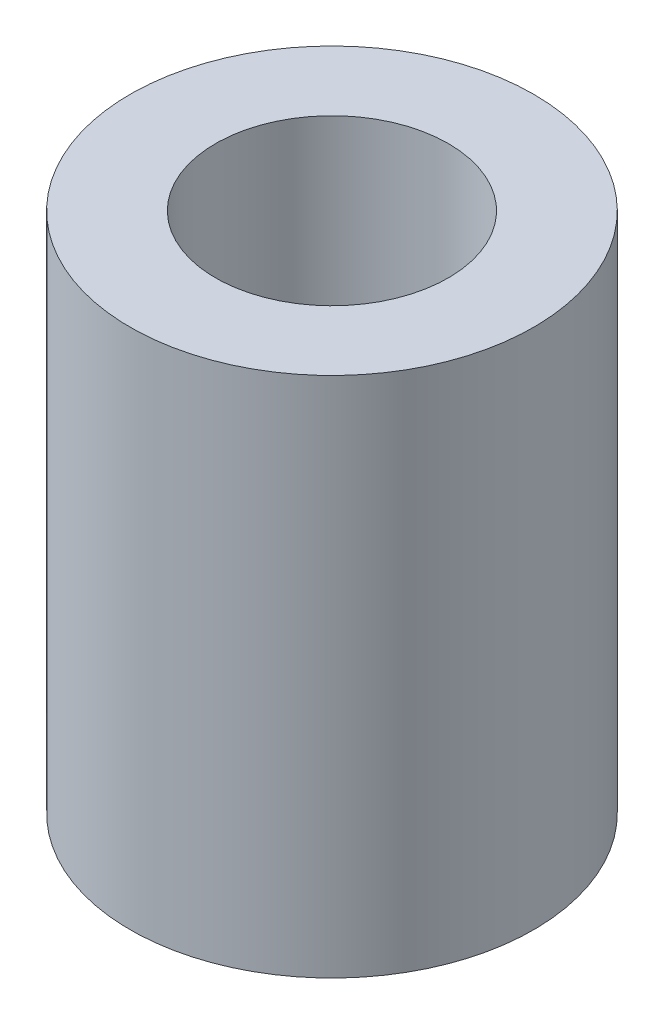
ISO-10303-21;
HEADER;
FILE_DESCRIPTION(('STEP AP214'),'2;1');
FILE_NAME('part.step','',(''),(''),'','','');
FILE_SCHEMA(('AUTOMOTIVE_DESIGN { 1 0 10303 214 1 1 1 1 }'));
ENDSEC;
DATA;
#1=APPLICATION_CONTEXT('core data for automotive mechanical design processes');
#2=APPLICATION_PROTOCOL_DEFINITION('international standard','automotive_design',2000,#1);
#3=PRODUCT_CONTEXT('',#1,'mechanical');
#4=PRODUCT('Part','Part','',(#3));
#5=PRODUCT_RELATED_PRODUCT_CATEGORY('part','',(#4));
#6=PRODUCT_DEFINITION_FORMATION('','',#4);
#7=PRODUCT_DEFINITION_CONTEXT('part definition',#1,'design');
#8=PRODUCT_DEFINITION('design','',#6,#7);
#9=PRODUCT_DEFINITION_SHAPE('','',#8);
#10=(LENGTH_UNIT() NAMED_UNIT(*) SI_UNIT(.MILLI.,.METRE.));
#11=(NAMED_UNIT(*) PLANE_ANGLE_UNIT() SI_UNIT($,.RADIAN.));
#12=(NAMED_UNIT(*) SI_UNIT($,.STERADIAN.) SOLID_ANGLE_UNIT());
#13=UNCERTAINTY_MEASURE_WITH_UNIT(LENGTH_MEASURE(1.E-05),#10,'distance_accuracy_value','');
#14=(GEOMETRIC_REPRESENTATION_CONTEXT(3) GLOBAL_UNCERTAINTY_ASSIGNED_CONTEXT((#13)) GLOBAL_UNIT_ASSIGNED_CONTEXT((#10,
#11,#12)) REPRESENTATION_CONTEXT('',''));
#15=CARTESIAN_POINT('',(0.,0.,0.));
#16=DIRECTION('',(0.,0.,1.));
#17=DIRECTION('',(1.,0.,0.));
#18=AXIS2_PLACEMENT_3D('',#15,#16,#17);
#19=CARTESIAN_POINT('',(0.,42.7,0.));
#20=DIRECTION('',(0.,1.,0.));
#21=DIRECTION('',(0.,0.,1.));
#22=AXIS2_PLACEMENT_3D('',#19,#20,#21);
#23=PLANE('',#22);
#24=CARTESIAN_POINT('',(0.,42.7,0.));
#25=DIRECTION('',(0.,1.,0.));
#26=DIRECTION('',(0.,0.,1.));
#27=AXIS2_PLACEMENT_3D('',#24,#25,#26);
#28=CIRCLE('',#27,16.51);
#29=CARTESIAN_POINT('',(0.,42.7,-16.51));
#30=VERTEX_POINT('',#29);
#31=EDGE_CURVE('E10',#30,#30,#28,.T.);
#32=ORIENTED_EDGE('',*,*,#31,.T.);
#33=EDGE_LOOP('',(#32));
#34=FACE_BOUND('',#33,.T.);
#35=CARTESIAN_POINT('',(0.,42.7,0.));
#36=DIRECTION('',(0.,1.,0.));
#37=DIRECTION('',(0.,0.,1.));
#38=AXIS2_PLACEMENT_3D('',#35,#36,#37);
#39=CIRCLE('',#38,9.525);
#40=CARTESIAN_POINT('',(0.,42.7,-9.525));
#41=VERTEX_POINT('',#40);
#42=EDGE_CURVE('E42',#41,#41,#39,.T.);
#43=ORIENTED_EDGE('',*,*,#42,.F.);
#44=EDGE_LOOP('',(#43));
#45=FACE_BOUND('',#44,.T.);
#46=ADVANCED_FACE('F31',(#34,#45),#23,.T.);
#47=CARTESIAN_POINT('',(0.,0.,0.));
#48=DIRECTION('',(0.,1.,0.));
#49=DIRECTION('',(0.,0.,1.));
#50=AXIS2_PLACEMENT_3D('',#47,#48,#49);
#51=PLANE('',#50);
#52=CARTESIAN_POINT('',(0.,0.,0.));
#53=DIRECTION('',(0.,1.,0.));
#54=DIRECTION('',(0.,0.,1.));
#55=AXIS2_PLACEMENT_3D('',#52,#53,#54);
#56=CIRCLE('',#55,16.51);
#57=CARTESIAN_POINT('',(0.,0.,-16.51));
#58=VERTEX_POINT('',#57);
#59=EDGE_CURVE('E35',#58,#58,#56,.T.);
#60=ORIENTED_EDGE('',*,*,#59,.F.);
#61=EDGE_LOOP('',(#60));
#62=FACE_BOUND('',#61,.T.);
#63=CARTESIAN_POINT('',(0.,0.,0.));
#64=DIRECTION('',(0.,1.,0.));
#65=DIRECTION('',(0.,0.,1.));
#66=AXIS2_PLACEMENT_3D('',#63,#64,#65);
#67=CIRCLE('',#66,9.525);
#68=CARTESIAN_POINT('',(0.,0.,-9.525));
#69=VERTEX_POINT('',#68);
#70=EDGE_CURVE('E44',#69,#69,#67,.T.);
#71=ORIENTED_EDGE('',*,*,#70,.T.);
#72=EDGE_LOOP('',(#71));
#73=FACE_BOUND('',#72,.T.);
#74=ADVANCED_FACE('F54',(#62,#73),#51,.F.);
#75=CARTESIAN_POINT('',(0.,42.7,0.));
#76=DIRECTION('',(0.,-1.,0.));
#77=DIRECTION('',(0.,0.,-1.));
#78=AXIS2_PLACEMENT_3D('',#75,#76,#77);
#79=CYLINDRICAL_SURFACE('',#78,16.51);
#80=CARTESIAN_POINT('',(0.,42.7,-16.51));
#81=CARTESIAN_POINT('',(0.,42.2552083333333,-16.51));
#82=CARTESIAN_POINT('',(0.,41.8104166666667,-16.51));
#83=CARTESIAN_POINT('',(0.,40.9208333333333,-16.51));
#84=CARTESIAN_POINT('',(0.,40.4760416666667,-16.51));
#85=CARTESIAN_POINT('',(0.,39.5864583333333,-16.51));
#86=CARTESIAN_POINT('',(0.,39.1416666666667,-16.51));
#87=CARTESIAN_POINT('',(0.,38.2520833333333,-16.51));
#88=CARTESIAN_POINT('',(0.,37.8072916666667,-16.51));
#89=CARTESIAN_POINT('',(0.,36.9177083333333,-16.51));
#90=CARTESIAN_POINT('',(0.,36.4729166666667,-16.51));
#91=CARTESIAN_POINT('',(0.,35.5833333333333,-16.51));
#92=CARTESIAN_POINT('',(0.,35.1385416666667,-16.51));
#93=CARTESIAN_POINT('',(0.,34.2489583333333,-16.51));
#94=CARTESIAN_POINT('',(0.,33.8041666666667,-16.51));
#95=CARTESIAN_POINT('',(0.,32.9145833333333,-16.51));
#96=CARTESIAN_POINT('',(0.,32.4697916666667,-16.51));
#97=CARTESIAN_POINT('',(0.,31.5802083333333,-16.51));
#98=CARTESIAN_POINT('',(0.,31.1354166666667,-16.51));
#99=CARTESIAN_POINT('',(0.,30.2458333333333,-16.51));
#100=CARTESIAN_POINT('',(0.,29.8010416666667,-16.51));
#101=CARTESIAN_POINT('',(0.,28.9114583333333,-16.51));
#102=CARTESIAN_POINT('',(0.,28.4666666666667,-16.51));
#103=CARTESIAN_POINT('',(0.,27.5770833333333,-16.51));
#104=CARTESIAN_POINT('',(0.,27.1322916666667,-16.51));
#105=CARTESIAN_POINT('',(0.,26.2427083333333,-16.51));
#106=CARTESIAN_POINT('',(0.,25.7979166666667,-16.51));
#107=CARTESIAN_POINT('',(0.,24.9083333333333,-16.51));
#108=CARTESIAN_POINT('',(0.,24.4635416666667,-16.51));
#109=CARTESIAN_POINT('',(0.,23.5739583333333,-16.51));
#110=CARTESIAN_POINT('',(0.,23.1291666666667,-16.51));
#111=CARTESIAN_POINT('',(0.,22.2395833333333,-16.51));
#112=CARTESIAN_POINT('',(0.,21.7947916666667,-16.51));
#113=CARTESIAN_POINT('',(0.,20.9052083333333,-16.51));
#114=CARTESIAN_POINT('',(0.,20.4604166666667,-16.51));
#115=CARTESIAN_POINT('',(0.,19.5708333333333,-16.51));
#116=CARTESIAN_POINT('',(0.,19.1260416666667,-16.51));
#117=CARTESIAN_POINT('',(0.,18.2364583333333,-16.51));
#118=CARTESIAN_POINT('',(0.,17.7916666666667,-16.51));
#119=CARTESIAN_POINT('',(0.,16.9020833333333,-16.51));
#120=CARTESIAN_POINT('',(0.,16.4572916666667,-16.51));
#121=CARTESIAN_POINT('',(0.,15.5677083333333,-16.51));
#122=CARTESIAN_POINT('',(0.,15.1229166666667,-16.51));
#123=CARTESIAN_POINT('',(0.,14.2333333333333,-16.51));
#124=CARTESIAN_POINT('',(0.,13.7885416666667,-16.51));
#125=CARTESIAN_POINT('',(0.,12.8989583333333,-16.51));
#126=CARTESIAN_POINT('',(0.,12.4541666666667,-16.51));
#127=CARTESIAN_POINT('',(0.,11.5645833333333,-16.51));
#128=CARTESIAN_POINT('',(0.,11.1197916666667,-16.51));
#129=CARTESIAN_POINT('',(0.,10.2302083333333,-16.51));
#130=CARTESIAN_POINT('',(0.,9.78541666666666,-16.51));
#131=CARTESIAN_POINT('',(0.,8.89583333333333,-16.51));
#132=CARTESIAN_POINT('',(0.,8.45104166666666,-16.51));
#133=CARTESIAN_POINT('',(0.,7.56145833333333,-16.51));
#134=CARTESIAN_POINT('',(0.,7.11666666666666,-16.51));
#135=CARTESIAN_POINT('',(0.,6.22708333333333,-16.51));
#136=CARTESIAN_POINT('',(0.,5.78229166666666,-16.51));
#137=CARTESIAN_POINT('',(0.,4.89270833333333,-16.51));
#138=CARTESIAN_POINT('',(0.,4.44791666666666,-16.51));
#139=CARTESIAN_POINT('',(0.,3.55833333333333,-16.51));
#140=CARTESIAN_POINT('',(0.,3.11354166666666,-16.51));
#141=CARTESIAN_POINT('',(0.,2.22395833333332,-16.51));
#142=CARTESIAN_POINT('',(0.,1.77916666666666,-16.51));
#143=CARTESIAN_POINT('',(0.,0.889583333333326,-16.51));
#144=CARTESIAN_POINT('',(0.,0.444791666666659,-16.51));
#145=CARTESIAN_POINT('',(0.,0.,-16.51));
#146=B_SPLINE_CURVE_WITH_KNOTS('',3,(#80,#81,#82,#83,#84,#85,#86,#87,#88,#89,#90,#91,#92,#93,
#94,#95,#96,#97,#98,#99,#100,#101,#102,#103,#104,#105,#106,#107,#108,#109,#110,#111,#112,#113,
#114,#115,#116,#117,#118,#119,#120,#121,#122,#123,#124,#125,#126,#127,#128,#129,#130,#131,#132,
#133,#134,#135,#136,#137,#138,#139,#140,#141,#142,#143,#144,#145),.UNSPECIFIED.,.F.,.F.,(4,2,2,
2,2,2,2,2,2,2,2,2,2,2,2,2,2,2,2,2,2,2,2,2,2,2,2,2,2,2,2,2,4),(0.,1.334375,2.66875,4.003125,
5.3375,6.671875,8.00625,9.340625,10.675,12.009375,13.34375,14.678125,16.0125,17.346875,18.68125,
20.015625,21.35,22.684375,24.01875,25.353125,26.6875,28.021875,29.35625,30.690625,32.025,
33.359375,34.69375,36.028125,37.3625,38.696875,40.03125,41.365625,42.7),.UNSPECIFIED.);
#147=EDGE_CURVE('BSEAM33',#30,#58,#146,.T.);
#148=ORIENTED_EDGE('',*,*,#31,.F.);
#149=ORIENTED_EDGE('',*,*,#59,.T.);
#150=ORIENTED_EDGE('',*,*,#147,.T.);
#151=ORIENTED_EDGE('',*,*,#147,.F.);
#152=EDGE_LOOP('',(#148,#150,#149,#151));
#153=FACE_BOUND('',#152,.T.);
#154=ADVANCED_FACE('F33',(#153),#79,.T.);
#155=CARTESIAN_POINT('',(0.,42.7,0.));
#156=DIRECTION('',(0.,-1.,0.));
#157=DIRECTION('',(0.,0.,-1.));
#158=AXIS2_PLACEMENT_3D('',#155,#156,#157);
#159=CYLINDRICAL_SURFACE('',#158,9.525);
#160=CARTESIAN_POINT('',(0.,42.7,-9.525));
#161=CARTESIAN_POINT('',(0.,42.2552083333333,-9.525));
#162=CARTESIAN_POINT('',(0.,41.8104166666667,-9.525));
#163=CARTESIAN_POINT('',(0.,40.9208333333333,-9.525));
#164=CARTESIAN_POINT('',(0.,40.4760416666667,-9.525));
#165=CARTESIAN_POINT('',(0.,39.5864583333333,-9.525));
#166=CARTESIAN_POINT('',(0.,39.1416666666667,-9.525));
#167=CARTESIAN_POINT('',(0.,38.2520833333333,-9.525));
#168=CARTESIAN_POINT('',(0.,37.8072916666667,-9.525));
#169=CARTESIAN_POINT('',(0.,36.9177083333333,-9.525));
#170=CARTESIAN_POINT('',(0.,36.4729166666667,-9.525));
#171=CARTESIAN_POINT('',(0.,35.5833333333333,-9.525));
#172=CARTESIAN_POINT('',(0.,35.1385416666667,-9.525));
#173=CARTESIAN_POINT('',(0.,34.2489583333333,-9.525));
#174=CARTESIAN_POINT('',(0.,33.8041666666667,-9.525));
#175=CARTESIAN_POINT('',(0.,32.9145833333333,-9.525));
#176=CARTESIAN_POINT('',(0.,32.4697916666667,-9.525));
#177=CARTESIAN_POINT('',(0.,31.5802083333333,-9.525));
#178=CARTESIAN_POINT('',(0.,31.1354166666667,-9.525));
#179=CARTESIAN_POINT('',(0.,30.2458333333333,-9.525));
#180=CARTESIAN_POINT('',(0.,29.8010416666667,-9.525));
#181=CARTESIAN_POINT('',(0.,28.9114583333333,-9.525));
#182=CARTESIAN_POINT('',(0.,28.4666666666667,-9.525));
#183=CARTESIAN_POINT('',(0.,27.5770833333333,-9.525));
#184=CARTESIAN_POINT('',(0.,27.1322916666667,-9.525));
#185=CARTESIAN_POINT('',(0.,26.2427083333333,-9.525));
#186=CARTESIAN_POINT('',(0.,25.7979166666667,-9.525));
#187=CARTESIAN_POINT('',(0.,24.9083333333333,-9.525));
#188=CARTESIAN_POINT('',(0.,24.4635416666667,-9.525));
#189=CARTESIAN_POINT('',(0.,23.5739583333333,-9.525));
#190=CARTESIAN_POINT('',(0.,23.1291666666667,-9.525));
#191=CARTESIAN_POINT('',(0.,22.2395833333333,-9.525));
#192=CARTESIAN_POINT('',(0.,21.7947916666667,-9.525));
#193=CARTESIAN_POINT('',(0.,20.9052083333333,-9.525));
#194=CARTESIAN_POINT('',(0.,20.4604166666667,-9.525));
#195=CARTESIAN_POINT('',(0.,19.5708333333333,-9.525));
#196=CARTESIAN_POINT('',(0.,19.1260416666667,-9.525));
#197=CARTESIAN_POINT('',(0.,18.2364583333333,-9.525));
#198=CARTESIAN_POINT('',(0.,17.7916666666667,-9.525));
#199=CARTESIAN_POINT('',(0.,16.9020833333333,-9.525));
#200=CARTESIAN_POINT('',(0.,16.4572916666667,-9.525));
#201=CARTESIAN_POINT('',(0.,15.5677083333333,-9.525));
#202=CARTESIAN_POINT('',(0.,15.1229166666667,-9.525));
#203=CARTESIAN_POINT('',(0.,14.2333333333333,-9.525));
#204=CARTESIAN_POINT('',(0.,13.7885416666667,-9.525));
#205=CARTESIAN_POINT('',(0.,12.8989583333333,-9.525));
#206=CARTESIAN_POINT('',(0.,12.4541666666667,-9.525));
#207=CARTESIAN_POINT('',(0.,11.5645833333333,-9.525));
#208=CARTESIAN_POINT('',(0.,11.1197916666667,-9.525));
#209=CARTESIAN_POINT('',(0.,10.2302083333333,-9.525));
#210=CARTESIAN_POINT('',(0.,9.78541666666666,-9.525));
#211=CARTESIAN_POINT('',(0.,8.89583333333333,-9.525));
#212=CARTESIAN_POINT('',(0.,8.45104166666667,-9.525));
#213=CARTESIAN_POINT('',(0.,7.56145833333333,-9.525));
#214=CARTESIAN_POINT('',(0.,7.11666666666666,-9.525));
#215=CARTESIAN_POINT('',(0.,6.22708333333333,-9.525));
#216=CARTESIAN_POINT('',(0.,5.78229166666666,-9.525));
#217=CARTESIAN_POINT('',(0.,4.89270833333333,-9.525));
#218=CARTESIAN_POINT('',(0.,4.44791666666666,-9.525));
#219=CARTESIAN_POINT('',(0.,3.55833333333333,-9.525));
#220=CARTESIAN_POINT('',(0.,3.11354166666666,-9.525));
#221=CARTESIAN_POINT('',(0.,2.22395833333332,-9.525));
#222=CARTESIAN_POINT('',(0.,1.77916666666666,-9.525));
#223=CARTESIAN_POINT('',(0.,0.889583333333326,-9.525));
#224=CARTESIAN_POINT('',(0.,0.444791666666659,-9.525));
#225=CARTESIAN_POINT('',(0.,0.,-9.525));
#226=B_SPLINE_CURVE_WITH_KNOTS('',3,(#160,#161,#162,#163,#164,#165,#166,#167,#168,#169,#170,
#171,#172,#173,#174,#175,#176,#177,#178,#179,#180,#181,#182,#183,#184,#185,#186,#187,#188,#189,
#190,#191,#192,#193,#194,#195,#196,#197,#198,#199,#200,#201,#202,#203,#204,#205,#206,#207,#208,
#209,#210,#211,#212,#213,#214,#215,#216,#217,#218,#219,#220,#221,#222,#223,#224,#225),
.UNSPECIFIED.,.F.,.F.,(4,2,2,2,2,2,2,2,2,2,2,2,2,2,2,2,2,2,2,2,2,2,2,2,2,2,2,2,2,2,2,2,4),(0.,
1.33437500000001,2.66875,4.003125,5.3375,6.67187500000001,8.00625000000001,9.340625,10.675,
12.009375,13.34375,14.678125,16.0125,17.346875,18.68125,20.015625,21.35,22.684375,24.01875,
25.353125,26.6875,28.021875,29.35625,30.690625,32.025,33.359375,34.69375,36.028125,37.3625,
38.696875,40.03125,41.365625,42.7),.UNSPECIFIED.);
#227=EDGE_CURVE('BSEAM50',#41,#69,#226,.T.);
#228=ORIENTED_EDGE('',*,*,#42,.T.);
#229=ORIENTED_EDGE('',*,*,#70,.F.);
#230=ORIENTED_EDGE('',*,*,#227,.T.);
#231=ORIENTED_EDGE('',*,*,#227,.F.);
#232=EDGE_LOOP('',(#228,#230,#229,#231));
#233=FACE_BOUND('',#232,.T.);
#234=ADVANCED_FACE('F50',(#233),#159,.F.);
#235=CLOSED_SHELL('',(#46,#74,#154,#234));
#236=MANIFOLD_SOLID_BREP('B2',#235);
#237=ADVANCED_BREP_SHAPE_REPRESENTATION('',(#18,#236),#14);
#238=SHAPE_DEFINITION_REPRESENTATION(#9,#237);
ENDSEC;
END-ISO-10303-21;
